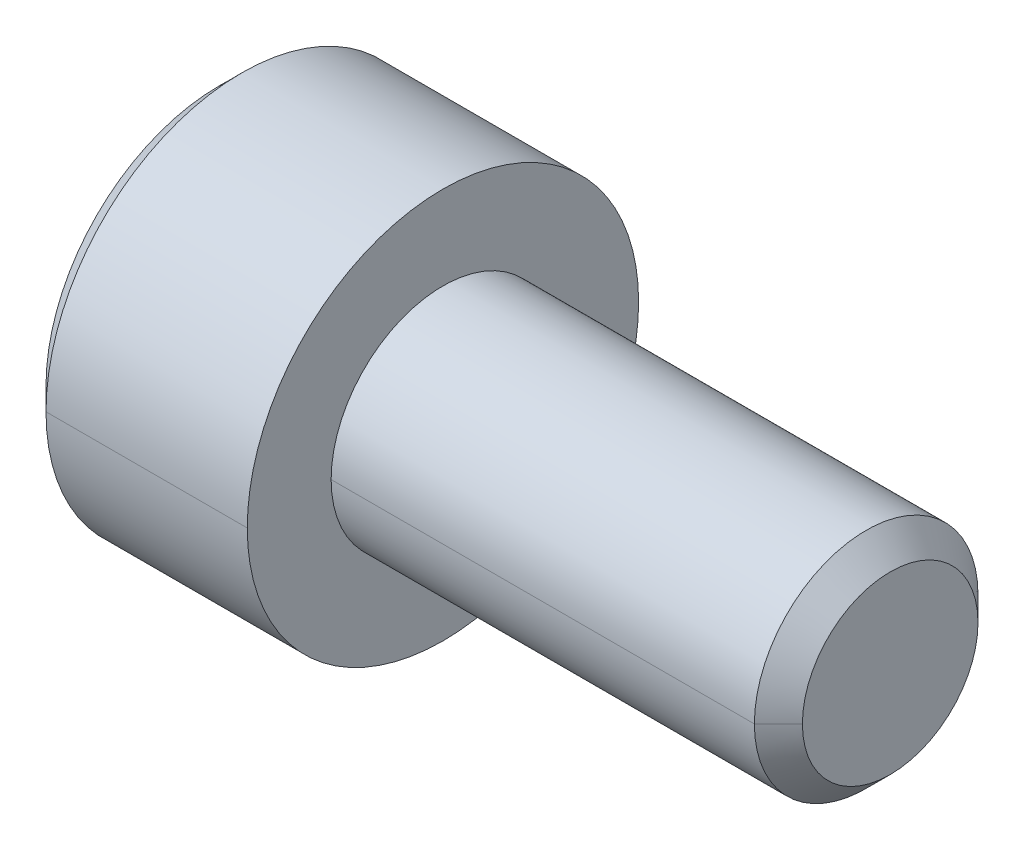
ISO-10303-21;
HEADER;
FILE_DESCRIPTION(('STEP AP214'),'2;1');
FILE_NAME('part.step','',(''),(''),'','','');
FILE_SCHEMA(('AUTOMOTIVE_DESIGN { 1 0 10303 214 1 1 1 1 }'));
ENDSEC;
DATA;
#1=APPLICATION_CONTEXT('core data for automotive mechanical design processes');
#2=APPLICATION_PROTOCOL_DEFINITION('international standard','automotive_design',2000,#1);
#3=PRODUCT_CONTEXT('',#1,'mechanical');
#4=PRODUCT('Part','Part','',(#3));
#5=PRODUCT_RELATED_PRODUCT_CATEGORY('part','',(#4));
#6=PRODUCT_DEFINITION_FORMATION('','',#4);
#7=PRODUCT_DEFINITION_CONTEXT('part definition',#1,'design');
#8=PRODUCT_DEFINITION('design','',#6,#7);
#9=PRODUCT_DEFINITION_SHAPE('','',#8);
#10=(LENGTH_UNIT() NAMED_UNIT(*) SI_UNIT(.MILLI.,.METRE.));
#11=(NAMED_UNIT(*) PLANE_ANGLE_UNIT() SI_UNIT($,.RADIAN.));
#12=(NAMED_UNIT(*) SI_UNIT($,.STERADIAN.) SOLID_ANGLE_UNIT());
#13=UNCERTAINTY_MEASURE_WITH_UNIT(LENGTH_MEASURE(1.E-05),#10,'distance_accuracy_value','');
#14=(GEOMETRIC_REPRESENTATION_CONTEXT(3) GLOBAL_UNCERTAINTY_ASSIGNED_CONTEXT((#13)) GLOBAL_UNIT_ASSIGNED_CONTEXT((#10,
#11,#12)) REPRESENTATION_CONTEXT('',''));
#15=CARTESIAN_POINT('',(0.,0.,0.));
#16=DIRECTION('',(0.,0.,1.));
#17=DIRECTION('',(1.,0.,0.));
#18=AXIS2_PLACEMENT_3D('',#15,#16,#17);
#19=CARTESIAN_POINT('',(-4.,0.,0.));
#20=DIRECTION('',(1.,0.,0.));
#21=DIRECTION('',(0.,-1.,0.));
#22=AXIS2_PLACEMENT_3D('',#19,#20,#21);
#23=CONICAL_SURFACE('',#22,3.1,0.7853981634);
#24=CARTESIAN_POINT('',(-3.6,0.,0.));
#25=DIRECTION('',(1.,0.,0.));
#26=DIRECTION('',(0.,0.,-1.));
#27=AXIS2_PLACEMENT_3D('',#24,#25,#26);
#28=CIRCLE('',#27,3.5);
#29=CARTESIAN_POINT('',(-3.6,0.,-3.5));
#30=VERTEX_POINT('',#29);
#31=CARTESIAN_POINT('',(-3.60000000000102,0.,3.50000000000102));
#32=VERTEX_POINT('',#31);
#33=EDGE_CURVE('E13',#30,#32,#28,.T.);
#34=ORIENTED_EDGE('',*,*,#33,.F.);
#35=DIRECTION('',(0.707106781184743,0.,-0.707106781188352));
#36=VECTOR('',#35,1.);
#37=CARTESIAN_POINT('',(-4.,0.,-3.1));
#38=LINE('',#37,#36);
#39=CARTESIAN_POINT('',(-4.,0.,-3.1));
#40=VERTEX_POINT('',#39);
#41=EDGE_CURVE('E34',#40,#30,#38,.T.);
#42=ORIENTED_EDGE('',*,*,#41,.F.);
#43=CARTESIAN_POINT('',(-4.,0.,0.));
#44=DIRECTION('',(1.,0.,0.));
#45=DIRECTION('',(0.,0.,-1.));
#46=AXIS2_PLACEMENT_3D('',#43,#44,#45);
#47=CIRCLE('',#46,3.1);
#48=CARTESIAN_POINT('',(-4.,0.,3.1));
#49=VERTEX_POINT('',#48);
#50=EDGE_CURVE('E205',#40,#49,#47,.T.);
#51=ORIENTED_EDGE('',*,*,#50,.T.);
#52=DIRECTION('',(0.707106781184743,0.,0.707106781188352));
#53=VECTOR('',#52,1.);
#54=CARTESIAN_POINT('',(-4.,0.,3.1));
#55=LINE('',#54,#53);
#56=EDGE_CURVE('E201',#49,#32,#55,.T.);
#57=ORIENTED_EDGE('',*,*,#56,.T.);
#58=EDGE_LOOP('',(#34,#42,#51,#57));
#59=FACE_BOUND('',#58,.T.);
#60=ADVANCED_FACE('F25',(#59),#23,.T.);
#61=CARTESIAN_POINT('',(-4.,0.,0.));
#62=DIRECTION('',(1.,0.,0.));
#63=DIRECTION('',(0.,1.,0.));
#64=AXIS2_PLACEMENT_3D('',#61,#62,#63);
#65=CONICAL_SURFACE('',#64,3.1,0.7853981634);
#66=CARTESIAN_POINT('',(-4.,0.,0.));
#67=DIRECTION('',(1.,0.,0.));
#68=DIRECTION('',(0.,0.,-1.));
#69=AXIS2_PLACEMENT_3D('',#66,#67,#68);
#70=CIRCLE('',#69,3.1);
#71=EDGE_CURVE('E200',#49,#40,#70,.T.);
#72=ORIENTED_EDGE('',*,*,#71,.T.);
#73=ORIENTED_EDGE('',*,*,#41,.T.);
#74=CARTESIAN_POINT('',(-3.6,0.,0.));
#75=DIRECTION('',(1.,0.,0.));
#76=DIRECTION('',(0.,0.,-1.));
#77=AXIS2_PLACEMENT_3D('',#74,#75,#76);
#78=CIRCLE('',#77,3.5);
#79=EDGE_CURVE('E488',#32,#30,#78,.T.);
#80=ORIENTED_EDGE('',*,*,#79,.F.);
#81=ORIENTED_EDGE('',*,*,#56,.F.);
#82=EDGE_LOOP('',(#72,#73,#80,#81));
#83=FACE_BOUND('',#82,.T.);
#84=ADVANCED_FACE('F504',(#83),#65,.T.);
#85=CARTESIAN_POINT('',(8.,0.,0.));
#86=DIRECTION('',(-1.,0.,0.));
#87=DIRECTION('',(0.,1.,0.));
#88=AXIS2_PLACEMENT_3D('',#85,#86,#87);
#89=CYLINDRICAL_SURFACE('',#88,3.5);
#90=ORIENTED_EDGE('',*,*,#79,.T.);
#91=DIRECTION('',(-1.,0.,0.));
#92=VECTOR('',#91,1.);
#93=CARTESIAN_POINT('',(0.,0.,-3.5));
#94=LINE('',#93,#92);
#95=CARTESIAN_POINT('',(0.,0.,-3.5));
#96=VERTEX_POINT('',#95);
#97=EDGE_CURVE('E482',#96,#30,#94,.T.);
#98=ORIENTED_EDGE('',*,*,#97,.F.);
#99=CARTESIAN_POINT('',(0.,0.,0.));
#100=DIRECTION('',(1.,0.,0.));
#101=DIRECTION('',(0.,0.,-1.));
#102=AXIS2_PLACEMENT_3D('',#99,#100,#101);
#103=CIRCLE('',#102,3.5);
#104=CARTESIAN_POINT('',(0.,0.,3.5));
#105=VERTEX_POINT('',#104);
#106=EDGE_CURVE('E478',#105,#96,#103,.T.);
#107=ORIENTED_EDGE('',*,*,#106,.F.);
#108=DIRECTION('',(-1.,0.,0.));
#109=VECTOR('',#108,1.);
#110=CARTESIAN_POINT('',(0.,0.,3.5));
#111=LINE('',#110,#109);
#112=EDGE_CURVE('E476',#105,#32,#111,.T.);
#113=ORIENTED_EDGE('',*,*,#112,.T.);
#114=EDGE_LOOP('',(#90,#98,#107,#113));
#115=FACE_BOUND('',#114,.T.);
#116=ADVANCED_FACE('F510',(#115),#89,.T.);
#117=CARTESIAN_POINT('',(8.,0.,0.));
#118=DIRECTION('',(-1.,0.,0.));
#119=DIRECTION('',(0.,-1.,0.));
#120=AXIS2_PLACEMENT_3D('',#117,#118,#119);
#121=CYLINDRICAL_SURFACE('',#120,3.5);
#122=CARTESIAN_POINT('',(0.,0.,0.));
#123=DIRECTION('',(1.,0.,0.));
#124=DIRECTION('',(0.,0.,-1.));
#125=AXIS2_PLACEMENT_3D('',#122,#123,#124);
#126=CIRCLE('',#125,3.5);
#127=EDGE_CURVE('E515',#96,#105,#126,.T.);
#128=ORIENTED_EDGE('',*,*,#127,.F.);
#129=ORIENTED_EDGE('',*,*,#97,.T.);
#130=ORIENTED_EDGE('',*,*,#33,.T.);
#131=ORIENTED_EDGE('',*,*,#112,.F.);
#132=EDGE_LOOP('',(#128,#129,#130,#131));
#133=FACE_BOUND('',#132,.T.);
#134=ADVANCED_FACE('F516',(#133),#121,.T.);
#135=CARTESIAN_POINT('',(0.,3.5,0.));
#136=DIRECTION('',(-1.,0.,0.));
#137=DIRECTION('',(0.,0.,1.));
#138=AXIS2_PLACEMENT_3D('',#135,#136,#137);
#139=PLANE('',#138);
#140=CARTESIAN_POINT('',(0.,0.,0.));
#141=DIRECTION('',(1.,0.,0.));
#142=DIRECTION('',(0.,0.,-1.));
#143=AXIS2_PLACEMENT_3D('',#140,#141,#142);
#144=CIRCLE('',#143,2.);
#145=CARTESIAN_POINT('',(0.,0.,-2.));
#146=VERTEX_POINT('',#145);
#147=CARTESIAN_POINT('',(0.,0.,2.));
#148=VERTEX_POINT('',#147);
#149=EDGE_CURVE('E519',#146,#148,#144,.T.);
#150=ORIENTED_EDGE('',*,*,#149,.F.);
#151=CARTESIAN_POINT('',(0.,0.,0.));
#152=DIRECTION('',(1.,0.,0.));
#153=DIRECTION('',(0.,0.,-1.));
#154=AXIS2_PLACEMENT_3D('',#151,#152,#153);
#155=CIRCLE('',#154,2.);
#156=EDGE_CURVE('E463',#148,#146,#155,.T.);
#157=ORIENTED_EDGE('',*,*,#156,.F.);
#158=EDGE_LOOP('',(#150,#157));
#159=FACE_BOUND('',#158,.T.);
#160=ORIENTED_EDGE('',*,*,#127,.T.);
#161=ORIENTED_EDGE('',*,*,#106,.T.);
#162=EDGE_LOOP('',(#160,#161));
#163=FACE_BOUND('',#162,.T.);
#164=ADVANCED_FACE('F521',(#159,#163),#139,.F.);
#165=CARTESIAN_POINT('',(8.,0.,0.));
#166=DIRECTION('',(-1.,0.,0.));
#167=DIRECTION('',(0.,1.,0.));
#168=AXIS2_PLACEMENT_3D('',#165,#166,#167);
#169=CYLINDRICAL_SURFACE('',#168,2.);
#170=ORIENTED_EDGE('',*,*,#156,.T.);
#171=DIRECTION('',(-1.,0.,0.));
#172=VECTOR('',#171,1.);
#173=CARTESIAN_POINT('',(7.5705,0.,-2.));
#174=LINE('',#173,#172);
#175=CARTESIAN_POINT('',(7.5705,0.,-2.));
#176=VERTEX_POINT('',#175);
#177=EDGE_CURVE('E458',#176,#146,#174,.T.);
#178=ORIENTED_EDGE('',*,*,#177,.F.);
#179=CARTESIAN_POINT('',(7.5705,0.,0.));
#180=DIRECTION('',(1.,0.,0.));
#181=DIRECTION('',(0.,0.,-1.));
#182=AXIS2_PLACEMENT_3D('',#179,#180,#181);
#183=CIRCLE('',#182,2.);
#184=CARTESIAN_POINT('',(7.5705,0.,2.));
#185=VERTEX_POINT('',#184);
#186=EDGE_CURVE('E457',#185,#176,#183,.T.);
#187=ORIENTED_EDGE('',*,*,#186,.F.);
#188=DIRECTION('',(-1.,0.,0.));
#189=VECTOR('',#188,1.);
#190=CARTESIAN_POINT('',(7.5705,0.,2.));
#191=LINE('',#190,#189);
#192=EDGE_CURVE('E442',#185,#148,#191,.T.);
#193=ORIENTED_EDGE('',*,*,#192,.T.);
#194=EDGE_LOOP('',(#170,#178,#187,#193));
#195=FACE_BOUND('',#194,.T.);
#196=ADVANCED_FACE('F523',(#195),#169,.T.);
#197=CARTESIAN_POINT('',(8.,0.,0.));
#198=DIRECTION('',(-1.,0.,0.));
#199=DIRECTION('',(0.,-1.,0.));
#200=AXIS2_PLACEMENT_3D('',#197,#198,#199);
#201=CYLINDRICAL_SURFACE('',#200,2.);
#202=CARTESIAN_POINT('',(7.5705,0.,0.));
#203=DIRECTION('',(1.,0.,0.));
#204=DIRECTION('',(0.,0.,-1.));
#205=AXIS2_PLACEMENT_3D('',#202,#203,#204);
#206=CIRCLE('',#205,2.);
#207=EDGE_CURVE('E435',#176,#185,#206,.T.);
#208=ORIENTED_EDGE('',*,*,#207,.F.);
#209=ORIENTED_EDGE('',*,*,#177,.T.);
#210=ORIENTED_EDGE('',*,*,#149,.T.);
#211=ORIENTED_EDGE('',*,*,#192,.F.);
#212=EDGE_LOOP('',(#208,#209,#210,#211));
#213=FACE_BOUND('',#212,.T.);
#214=ADVANCED_FACE('F531',(#213),#201,.T.);
#215=CARTESIAN_POINT('',(7.5705,0.,0.));
#216=DIRECTION('',(-1.,0.,0.));
#217=DIRECTION('',(0.,-1.,0.));
#218=AXIS2_PLACEMENT_3D('',#215,#216,#217);
#219=CONICAL_SURFACE('',#218,2.,0.7853981634);
#220=CARTESIAN_POINT('',(8.,0.,0.));
#221=DIRECTION('',(1.,0.,0.));
#222=DIRECTION('',(0.,0.,-1.));
#223=AXIS2_PLACEMENT_3D('',#220,#221,#222);
#224=CIRCLE('',#223,1.5705);
#225=CARTESIAN_POINT('',(8.,0.,-1.5705));
#226=VERTEX_POINT('',#225);
#227=CARTESIAN_POINT('',(7.9999999999989,0.,1.5704999999989));
#228=VERTEX_POINT('',#227);
#229=EDGE_CURVE('E431',#226,#228,#224,.T.);
#230=ORIENTED_EDGE('',*,*,#229,.F.);
#231=DIRECTION('',(-0.707106781184742,0.,-0.707106781188353));
#232=VECTOR('',#231,1.);
#233=CARTESIAN_POINT('',(7.9999999999989,0.,-1.5704999999989));
#234=LINE('',#233,#232);
#235=EDGE_CURVE('E424',#226,#176,#234,.T.);
#236=ORIENTED_EDGE('',*,*,#235,.T.);
#237=ORIENTED_EDGE('',*,*,#207,.T.);
#238=DIRECTION('',(-0.707106781184742,0.,0.707106781188353));
#239=VECTOR('',#238,1.);
#240=CARTESIAN_POINT('',(7.9999999999989,0.,1.5704999999989));
#241=LINE('',#240,#239);
#242=EDGE_CURVE('E410',#228,#185,#241,.T.);
#243=ORIENTED_EDGE('',*,*,#242,.F.);
#244=EDGE_LOOP('',(#230,#236,#237,#243));
#245=FACE_BOUND('',#244,.T.);
#246=ADVANCED_FACE('F568',(#245),#219,.T.);
#247=CARTESIAN_POINT('',(7.5705,0.,0.));
#248=DIRECTION('',(-1.,0.,0.));
#249=DIRECTION('',(0.,1.,0.));
#250=AXIS2_PLACEMENT_3D('',#247,#248,#249);
#251=CONICAL_SURFACE('',#250,2.,0.7853981634);
#252=ORIENTED_EDGE('',*,*,#186,.T.);
#253=ORIENTED_EDGE('',*,*,#235,.F.);
#254=CARTESIAN_POINT('',(8.,0.,0.));
#255=DIRECTION('',(1.,0.,0.));
#256=DIRECTION('',(0.,0.,-1.));
#257=AXIS2_PLACEMENT_3D('',#254,#255,#256);
#258=CIRCLE('',#257,1.5705);
#259=EDGE_CURVE('E404',#228,#226,#258,.T.);
#260=ORIENTED_EDGE('',*,*,#259,.F.);
#261=ORIENTED_EDGE('',*,*,#242,.T.);
#262=EDGE_LOOP('',(#252,#253,#260,#261));
#263=FACE_BOUND('',#262,.T.);
#264=ADVANCED_FACE('F577',(#263),#251,.T.);
#265=CARTESIAN_POINT('',(8.,1.5705,0.));
#266=DIRECTION('',(-1.,0.,0.));
#267=DIRECTION('',(0.,0.,1.));
#268=AXIS2_PLACEMENT_3D('',#265,#266,#267);
#269=PLANE('',#268);
#270=ORIENTED_EDGE('',*,*,#229,.T.);
#271=ORIENTED_EDGE('',*,*,#259,.T.);
#272=EDGE_LOOP('',(#270,#271));
#273=FACE_BOUND('',#272,.T.);
#274=ADVANCED_FACE('F586',(#273),#269,.F.);
#275=CARTESIAN_POINT('',(-4.,0.,0.));
#276=DIRECTION('',(1.,0.,0.));
#277=DIRECTION('',(0.,0.,-1.));
#278=AXIS2_PLACEMENT_3D('',#275,#276,#277);
#279=PLANE('',#278);
#280=ORIENTED_EDGE('',*,*,#50,.F.);
#281=ORIENTED_EDGE('',*,*,#71,.F.);
#282=EDGE_LOOP('',(#280,#281));
#283=FACE_BOUND('',#282,.T.);
#284=DIRECTION('',(0.,0.500000000000009,-0.866025403784433));
#285=VECTOR('',#284,1.);
#286=CARTESIAN_POINT('',(-4.,-1.7320508075689,0.));
#287=LINE('',#286,#285);
#288=CARTESIAN_POINT('',(-4.,-1.7320508075689,0.));
#289=VERTEX_POINT('',#288);
#290=CARTESIAN_POINT('',(-4.,-0.86602540378444,-1.5));
#291=VERTEX_POINT('',#290);
#292=EDGE_CURVE('E393',#289,#291,#287,.T.);
#293=ORIENTED_EDGE('',*,*,#292,.T.);
#294=DIRECTION('',(0.,1.,0.));
#295=VECTOR('',#294,1.);
#296=CARTESIAN_POINT('',(-4.,-0.86602540378444,-1.5));
#297=LINE('',#296,#295);
#298=CARTESIAN_POINT('',(-4.,0.86602540378444,-1.5));
#299=VERTEX_POINT('',#298);
#300=EDGE_CURVE('E405',#291,#299,#297,.T.);
#301=ORIENTED_EDGE('',*,*,#300,.T.);
#302=DIRECTION('',(0.,0.500000000000009,0.866025403784433));
#303=VECTOR('',#302,1.);
#304=CARTESIAN_POINT('',(-4.,0.86602540378444,-1.5));
#305=LINE('',#304,#303);
#306=CARTESIAN_POINT('',(-4.,1.7320508075689,0.));
#307=VERTEX_POINT('',#306);
#308=EDGE_CURVE('E412',#299,#307,#305,.T.);
#309=ORIENTED_EDGE('',*,*,#308,.T.);
#310=DIRECTION('',(0.,-0.500000000000009,0.866025403784433));
#311=VECTOR('',#310,1.);
#312=CARTESIAN_POINT('',(-4.,1.7320508075689,0.));
#313=LINE('',#312,#311);
#314=CARTESIAN_POINT('',(-4.,0.86602540378444,1.5));
#315=VERTEX_POINT('',#314);
#316=EDGE_CURVE('E277',#307,#315,#313,.T.);
#317=ORIENTED_EDGE('',*,*,#316,.T.);
#318=DIRECTION('',(0.,-1.,0.));
#319=VECTOR('',#318,1.);
#320=CARTESIAN_POINT('',(-4.,0.86602540378444,1.5));
#321=LINE('',#320,#319);
#322=CARTESIAN_POINT('',(-4.,-0.86602540378444,1.5));
#323=VERTEX_POINT('',#322);
#324=EDGE_CURVE('E273',#315,#323,#321,.T.);
#325=ORIENTED_EDGE('',*,*,#324,.T.);
#326=DIRECTION('',(0.,-0.500000000000009,-0.866025403784433));
#327=VECTOR('',#326,1.);
#328=CARTESIAN_POINT('',(-4.,-0.86602540378444,1.5));
#329=LINE('',#328,#327);
#330=EDGE_CURVE('E271',#323,#289,#329,.T.);
#331=ORIENTED_EDGE('',*,*,#330,.T.);
#332=EDGE_LOOP('',(#293,#301,#309,#317,#325,#331));
#333=FACE_BOUND('',#332,.T.);
#334=ADVANCED_FACE('F391',(#283,#333),#279,.F.);
#335=CARTESIAN_POINT('',(-2.,-0.86602540378444,1.5));
#336=DIRECTION('',(0.,0.866025403784433,-0.500000000000009));
#337=DIRECTION('',(0.,0.500000000000009,0.866025403784433));
#338=AXIS2_PLACEMENT_3D('',#335,#336,#337);
#339=PLANE('',#338);
#340=ORIENTED_EDGE('',*,*,#330,.F.);
#341=DIRECTION('',(-1.,0.,0.));
#342=VECTOR('',#341,1.);
#343=CARTESIAN_POINT('',(-2.,-0.86602540378444,1.5));
#344=LINE('',#343,#342);
#345=CARTESIAN_POINT('',(-2.,-0.86602540378444,1.5));
#346=VERTEX_POINT('',#345);
#347=EDGE_CURVE('E380',#346,#323,#344,.T.);
#348=ORIENTED_EDGE('',*,*,#347,.F.);
#349=DIRECTION('',(0.,-0.500000000000009,-0.866025403784433));
#350=VECTOR('',#349,1.);
#351=CARTESIAN_POINT('',(-2.,-0.86602540378444,1.5));
#352=LINE('',#351,#350);
#353=CARTESIAN_POINT('',(-2.,-1.29903810567666,0.750000000000019));
#354=VERTEX_POINT('',#353);
#355=EDGE_CURVE('E375',#346,#354,#352,.T.);
#356=ORIENTED_EDGE('',*,*,#355,.T.);
#357=DIRECTION('',(0.,-0.500000000000009,-0.866025403784433));
#358=VECTOR('',#357,1.);
#359=CARTESIAN_POINT('',(-2.,-0.86602540378444,1.5));
#360=LINE('',#359,#358);
#361=CARTESIAN_POINT('',(-2.,-1.7320508075689,0.));
#362=VERTEX_POINT('',#361);
#363=EDGE_CURVE('E370',#354,#362,#360,.T.);
#364=ORIENTED_EDGE('',*,*,#363,.T.);
#365=DIRECTION('',(-1.,0.,0.));
#366=VECTOR('',#365,1.);
#367=CARTESIAN_POINT('',(-2.,-1.7320508075689,0.));
#368=LINE('',#367,#366);
#369=EDGE_CURVE('E364',#362,#289,#368,.T.);
#370=ORIENTED_EDGE('',*,*,#369,.T.);
#371=EDGE_LOOP('',(#340,#348,#356,#364,#370));
#372=FACE_BOUND('',#371,.T.);
#373=ADVANCED_FACE('F396',(#372),#339,.T.);
#374=CARTESIAN_POINT('',(-2.,-1.7320508075689,0.));
#375=DIRECTION('',(0.,0.866025403784433,0.500000000000009));
#376=DIRECTION('',(0.,-0.500000000000009,0.866025403784433));
#377=AXIS2_PLACEMENT_3D('',#374,#375,#376);
#378=PLANE('',#377);
#379=ORIENTED_EDGE('',*,*,#292,.F.);
#380=ORIENTED_EDGE('',*,*,#369,.F.);
#381=DIRECTION('',(0.,0.500000000000009,-0.866025403784433));
#382=VECTOR('',#381,1.);
#383=CARTESIAN_POINT('',(-2.,-1.7320508075689,0.));
#384=LINE('',#383,#382);
#385=CARTESIAN_POINT('',(-2.,-1.29903810567665,-0.750000000000014));
#386=VERTEX_POINT('',#385);
#387=EDGE_CURVE('E359',#362,#386,#384,.T.);
#388=ORIENTED_EDGE('',*,*,#387,.T.);
#389=DIRECTION('',(0.,0.500000000000009,-0.866025403784433));
#390=VECTOR('',#389,1.);
#391=CARTESIAN_POINT('',(-2.,-1.7320508075689,0.));
#392=LINE('',#391,#390);
#393=CARTESIAN_POINT('',(-2.,-0.86602540378444,-1.5));
#394=VERTEX_POINT('',#393);
#395=EDGE_CURVE('E354',#386,#394,#392,.T.);
#396=ORIENTED_EDGE('',*,*,#395,.T.);
#397=DIRECTION('',(-1.,0.,0.));
#398=VECTOR('',#397,1.);
#399=CARTESIAN_POINT('',(-2.,-0.86602540378444,-1.5));
#400=LINE('',#399,#398);
#401=EDGE_CURVE('E348',#394,#291,#400,.T.);
#402=ORIENTED_EDGE('',*,*,#401,.T.);
#403=EDGE_LOOP('',(#379,#380,#388,#396,#402));
#404=FACE_BOUND('',#403,.T.);
#405=ADVANCED_FACE('F400',(#404),#378,.T.);
#406=CARTESIAN_POINT('',(-2.,-0.86602540378444,-1.5));
#407=DIRECTION('',(0.,0.,1.));
#408=DIRECTION('',(1.,0.,0.));
#409=AXIS2_PLACEMENT_3D('',#406,#407,#408);
#410=PLANE('',#409);
#411=ORIENTED_EDGE('',*,*,#300,.F.);
#412=ORIENTED_EDGE('',*,*,#401,.F.);
#413=DIRECTION('',(0.,1.,0.));
#414=VECTOR('',#413,1.);
#415=CARTESIAN_POINT('',(-2.,-0.86602540378444,-1.5));
#416=LINE('',#415,#414);
#417=CARTESIAN_POINT('',(-2.,0.,-1.5));
#418=VERTEX_POINT('',#417);
#419=EDGE_CURVE('E343',#394,#418,#416,.T.);
#420=ORIENTED_EDGE('',*,*,#419,.T.);
#421=DIRECTION('',(0.,1.,0.));
#422=VECTOR('',#421,1.);
#423=CARTESIAN_POINT('',(-2.,-0.86602540378444,-1.5));
#424=LINE('',#423,#422);
#425=CARTESIAN_POINT('',(-2.,0.86602540378444,-1.5));
#426=VERTEX_POINT('',#425);
#427=EDGE_CURVE('E338',#418,#426,#424,.T.);
#428=ORIENTED_EDGE('',*,*,#427,.T.);
#429=DIRECTION('',(-1.,0.,0.));
#430=VECTOR('',#429,1.);
#431=CARTESIAN_POINT('',(-2.,0.86602540378444,-1.5));
#432=LINE('',#431,#430);
#433=EDGE_CURVE('E332',#426,#299,#432,.T.);
#434=ORIENTED_EDGE('',*,*,#433,.T.);
#435=EDGE_LOOP('',(#411,#412,#420,#428,#434));
#436=FACE_BOUND('',#435,.T.);
#437=ADVANCED_FACE('F617',(#436),#410,.T.);
#438=CARTESIAN_POINT('',(-2.,0.86602540378444,-1.5));
#439=DIRECTION('',(0.,-0.866025403784433,0.500000000000009));
#440=DIRECTION('',(0.,-0.500000000000009,-0.866025403784433));
#441=AXIS2_PLACEMENT_3D('',#438,#439,#440);
#442=PLANE('',#441);
#443=ORIENTED_EDGE('',*,*,#308,.F.);
#444=ORIENTED_EDGE('',*,*,#433,.F.);
#445=DIRECTION('',(0.,0.500000000000009,0.866025403784433));
#446=VECTOR('',#445,1.);
#447=CARTESIAN_POINT('',(-2.,0.86602540378444,-1.5));
#448=LINE('',#447,#446);
#449=CARTESIAN_POINT('',(-2.,1.29903810567666,-0.750000000000019));
#450=VERTEX_POINT('',#449);
#451=EDGE_CURVE('E326',#426,#450,#448,.T.);
#452=ORIENTED_EDGE('',*,*,#451,.T.);
#453=DIRECTION('',(0.,0.500000000000009,0.866025403784433));
#454=VECTOR('',#453,1.);
#455=CARTESIAN_POINT('',(-2.,0.86602540378444,-1.5));
#456=LINE('',#455,#454);
#457=CARTESIAN_POINT('',(-2.,1.7320508075689,0.));
#458=VERTEX_POINT('',#457);
#459=EDGE_CURVE('E321',#450,#458,#456,.T.);
#460=ORIENTED_EDGE('',*,*,#459,.T.);
#461=DIRECTION('',(-1.,0.,0.));
#462=VECTOR('',#461,1.);
#463=CARTESIAN_POINT('',(-2.,1.7320508075689,0.));
#464=LINE('',#463,#462);
#465=EDGE_CURVE('E315',#458,#307,#464,.T.);
#466=ORIENTED_EDGE('',*,*,#465,.T.);
#467=EDGE_LOOP('',(#443,#444,#452,#460,#466));
#468=FACE_BOUND('',#467,.T.);
#469=ADVANCED_FACE('F625',(#468),#442,.T.);
#470=CARTESIAN_POINT('',(-2.,1.7320508075689,0.));
#471=DIRECTION('',(0.,-0.866025403784433,-0.500000000000009));
#472=DIRECTION('',(0.,0.500000000000009,-0.866025403784433));
#473=AXIS2_PLACEMENT_3D('',#470,#471,#472);
#474=PLANE('',#473);
#475=ORIENTED_EDGE('',*,*,#316,.F.);
#476=ORIENTED_EDGE('',*,*,#465,.F.);
#477=DIRECTION('',(0.,-0.500000000000009,0.866025403784433));
#478=VECTOR('',#477,1.);
#479=CARTESIAN_POINT('',(-2.,1.7320508075689,0.));
#480=LINE('',#479,#478);
#481=CARTESIAN_POINT('',(-2.,1.29903810567666,0.750000000000019));
#482=VERTEX_POINT('',#481);
#483=EDGE_CURVE('E310',#458,#482,#480,.T.);
#484=ORIENTED_EDGE('',*,*,#483,.T.);
#485=DIRECTION('',(0.,-0.500000000000009,0.866025403784433));
#486=VECTOR('',#485,1.);
#487=CARTESIAN_POINT('',(-2.,1.7320508075689,0.));
#488=LINE('',#487,#486);
#489=CARTESIAN_POINT('',(-2.,0.86602540378444,1.5));
#490=VERTEX_POINT('',#489);
#491=EDGE_CURVE('E305',#482,#490,#488,.T.);
#492=ORIENTED_EDGE('',*,*,#491,.T.);
#493=DIRECTION('',(-1.,0.,0.));
#494=VECTOR('',#493,1.);
#495=CARTESIAN_POINT('',(-2.,0.86602540378444,1.5));
#496=LINE('',#495,#494);
#497=EDGE_CURVE('E299',#490,#315,#496,.T.);
#498=ORIENTED_EDGE('',*,*,#497,.T.);
#499=EDGE_LOOP('',(#475,#476,#484,#492,#498));
#500=FACE_BOUND('',#499,.T.);
#501=ADVANCED_FACE('F634',(#500),#474,.T.);
#502=CARTESIAN_POINT('',(-2.,0.86602540378444,1.5));
#503=DIRECTION('',(0.,0.,-1.));
#504=DIRECTION('',(-1.,0.,0.));
#505=AXIS2_PLACEMENT_3D('',#502,#503,#504);
#506=PLANE('',#505);
#507=ORIENTED_EDGE('',*,*,#324,.F.);
#508=ORIENTED_EDGE('',*,*,#497,.F.);
#509=DIRECTION('',(0.,-1.,0.));
#510=VECTOR('',#509,1.);
#511=CARTESIAN_POINT('',(-2.,0.86602540378444,1.5));
#512=LINE('',#511,#510);
#513=CARTESIAN_POINT('',(-2.,0.,1.5));
#514=VERTEX_POINT('',#513);
#515=EDGE_CURVE('E294',#490,#514,#512,.T.);
#516=ORIENTED_EDGE('',*,*,#515,.T.);
#517=DIRECTION('',(0.,-1.,0.));
#518=VECTOR('',#517,1.);
#519=CARTESIAN_POINT('',(-2.,0.86602540378444,1.5));
#520=LINE('',#519,#518);
#521=EDGE_CURVE('E159',#514,#346,#520,.T.);
#522=ORIENTED_EDGE('',*,*,#521,.T.);
#523=ORIENTED_EDGE('',*,*,#347,.T.);
#524=EDGE_LOOP('',(#507,#508,#516,#522,#523));
#525=FACE_BOUND('',#524,.T.);
#526=ADVANCED_FACE('F643',(#525),#506,.T.);
#527=CARTESIAN_POINT('',(-2.,0.,0.));
#528=DIRECTION('',(1.,0.,0.));
#529=DIRECTION('',(0.,0.,-1.));
#530=AXIS2_PLACEMENT_3D('',#527,#528,#529);
#531=PLANE('',#530);
#532=CARTESIAN_POINT('',(-2.,0.,0.));
#533=DIRECTION('',(1.,0.,0.));
#534=DIRECTION('',(0.,0.,-1.));
#535=AXIS2_PLACEMENT_3D('',#532,#533,#534);
#536=CIRCLE('',#535,1.5);
#537=EDGE_CURVE('E140',#514,#354,#536,.T.);
#538=ORIENTED_EDGE('',*,*,#537,.T.);
#539=ORIENTED_EDGE('',*,*,#355,.F.);
#540=ORIENTED_EDGE('',*,*,#521,.F.);
#541=EDGE_LOOP('',(#538,#539,#540));
#542=FACE_BOUND('',#541,.T.);
#543=ADVANCED_FACE('F652',(#542),#531,.F.);
#544=CARTESIAN_POINT('',(-2.,0.,0.));
#545=DIRECTION('',(-1.,0.,0.));
#546=DIRECTION('',(0.,1.,0.));
#547=AXIS2_PLACEMENT_3D('',#544,#545,#546);
#548=CONICAL_SURFACE('',#547,1.5,1.308996939);
#549=DIRECTION('',(-0.258819045098413,0.,-0.965925826290169));
#550=VECTOR('',#549,1.);
#551=CARTESIAN_POINT('',(-1.59807621136015,0.,0.));
#552=LINE('',#551,#550);
#553=CARTESIAN_POINT('',(-1.5980762113533,0.,0.));
#554=VERTEX_POINT('',#553);
#555=EDGE_CURVE('E136',#554,#418,#552,.T.);
#556=ORIENTED_EDGE('',*,*,#555,.T.);
#557=CARTESIAN_POINT('',(-2.,0.,0.));
#558=DIRECTION('',(1.,0.,0.));
#559=DIRECTION('',(0.,0.,-1.));
#560=AXIS2_PLACEMENT_3D('',#557,#558,#559);
#561=CIRCLE('',#560,1.5);
#562=EDGE_CURVE('E154',#386,#418,#561,.T.);
#563=ORIENTED_EDGE('',*,*,#562,.F.);
#564=CARTESIAN_POINT('',(-2.,0.,0.));
#565=DIRECTION('',(1.,0.,0.));
#566=DIRECTION('',(0.,0.,-1.));
#567=AXIS2_PLACEMENT_3D('',#564,#565,#566);
#568=CIRCLE('',#567,1.5);
#569=EDGE_CURVE('E145',#354,#386,#568,.T.);
#570=ORIENTED_EDGE('',*,*,#569,.F.);
#571=ORIENTED_EDGE('',*,*,#537,.F.);
#572=DIRECTION('',(-0.258819045098413,0.,0.965925826290169));
#573=VECTOR('',#572,1.);
#574=CARTESIAN_POINT('',(-1.59807621136015,0.,0.));
#575=LINE('',#574,#573);
#576=EDGE_CURVE('E132',#554,#514,#575,.T.);
#577=ORIENTED_EDGE('',*,*,#576,.F.);
#578=EDGE_LOOP('',(#556,#563,#570,#571,#577));
#579=FACE_BOUND('',#578,.T.);
#580=ADVANCED_FACE('F134',(#579),#548,.F.);
#581=CARTESIAN_POINT('',(-2.,0.,0.));
#582=DIRECTION('',(-1.,0.,0.));
#583=DIRECTION('',(0.,-1.,0.));
#584=AXIS2_PLACEMENT_3D('',#581,#582,#583);
#585=CONICAL_SURFACE('',#584,1.5,1.308996939);
#586=ORIENTED_EDGE('',*,*,#576,.T.);
#587=CARTESIAN_POINT('',(-2.,0.,0.));
#588=DIRECTION('',(1.,0.,0.));
#589=DIRECTION('',(0.,0.,-1.));
#590=AXIS2_PLACEMENT_3D('',#587,#588,#589);
#591=CIRCLE('',#590,1.5);
#592=EDGE_CURVE('E146',#482,#514,#591,.T.);
#593=ORIENTED_EDGE('',*,*,#592,.F.);
#594=CARTESIAN_POINT('',(-2.,0.,0.));
#595=DIRECTION('',(1.,0.,0.));
#596=DIRECTION('',(0.,0.,-1.));
#597=AXIS2_PLACEMENT_3D('',#594,#595,#596);
#598=CIRCLE('',#597,1.5);
#599=EDGE_CURVE('E855',#450,#482,#598,.T.);
#600=ORIENTED_EDGE('',*,*,#599,.F.);
#601=CARTESIAN_POINT('',(-2.,0.,0.));
#602=DIRECTION('',(1.,0.,0.));
#603=DIRECTION('',(0.,0.,-1.));
#604=AXIS2_PLACEMENT_3D('',#601,#602,#603);
#605=CIRCLE('',#604,1.5);
#606=EDGE_CURVE('E151',#418,#450,#605,.T.);
#607=ORIENTED_EDGE('',*,*,#606,.F.);
#608=ORIENTED_EDGE('',*,*,#555,.F.);
#609=EDGE_LOOP('',(#586,#593,#600,#607,#608));
#610=FACE_BOUND('',#609,.T.);
#611=ADVANCED_FACE('F148',(#610),#585,.F.);
#612=CARTESIAN_POINT('',(-2.,0.,0.));
#613=DIRECTION('',(1.,0.,0.));
#614=DIRECTION('',(0.,0.,-1.));
#615=AXIS2_PLACEMENT_3D('',#612,#613,#614);
#616=PLANE('',#615);
#617=ORIENTED_EDGE('',*,*,#606,.T.);
#618=ORIENTED_EDGE('',*,*,#451,.F.);
#619=ORIENTED_EDGE('',*,*,#427,.F.);
#620=EDGE_LOOP('',(#617,#618,#619));
#621=FACE_BOUND('',#620,.T.);
#622=ADVANCED_FACE('F675',(#621),#616,.F.);
#623=CARTESIAN_POINT('',(-2.,0.,0.));
#624=DIRECTION('',(1.,0.,0.));
#625=DIRECTION('',(0.,0.,-1.));
#626=AXIS2_PLACEMENT_3D('',#623,#624,#625);
#627=PLANE('',#626);
#628=ORIENTED_EDGE('',*,*,#459,.F.);
#629=ORIENTED_EDGE('',*,*,#599,.T.);
#630=ORIENTED_EDGE('',*,*,#483,.F.);
#631=EDGE_LOOP('',(#628,#629,#630));
#632=FACE_BOUND('',#631,.T.);
#633=ADVANCED_FACE('F683',(#632),#627,.F.);
#634=CARTESIAN_POINT('',(-2.,0.,0.));
#635=DIRECTION('',(1.,0.,0.));
#636=DIRECTION('',(0.,0.,-1.));
#637=AXIS2_PLACEMENT_3D('',#634,#635,#636);
#638=PLANE('',#637);
#639=ORIENTED_EDGE('',*,*,#592,.T.);
#640=ORIENTED_EDGE('',*,*,#515,.F.);
#641=ORIENTED_EDGE('',*,*,#491,.F.);
#642=EDGE_LOOP('',(#639,#640,#641));
#643=FACE_BOUND('',#642,.T.);
#644=ADVANCED_FACE('F692',(#643),#638,.F.);
#645=CARTESIAN_POINT('',(-2.,0.,0.));
#646=DIRECTION('',(1.,0.,0.));
#647=DIRECTION('',(0.,0.,-1.));
#648=AXIS2_PLACEMENT_3D('',#645,#646,#647);
#649=PLANE('',#648);
#650=ORIENTED_EDGE('',*,*,#569,.T.);
#651=ORIENTED_EDGE('',*,*,#387,.F.);
#652=ORIENTED_EDGE('',*,*,#363,.F.);
#653=EDGE_LOOP('',(#650,#651,#652));
#654=FACE_BOUND('',#653,.T.);
#655=ADVANCED_FACE('F701',(#654),#649,.F.);
#656=CARTESIAN_POINT('',(-2.,0.,0.));
#657=DIRECTION('',(1.,0.,0.));
#658=DIRECTION('',(0.,0.,-1.));
#659=AXIS2_PLACEMENT_3D('',#656,#657,#658);
#660=PLANE('',#659);
#661=ORIENTED_EDGE('',*,*,#562,.T.);
#662=ORIENTED_EDGE('',*,*,#419,.F.);
#663=ORIENTED_EDGE('',*,*,#395,.F.);
#664=EDGE_LOOP('',(#661,#662,#663));
#665=FACE_BOUND('',#664,.T.);
#666=ADVANCED_FACE('F710',(#665),#660,.F.);
#667=CLOSED_SHELL('',(#60,#84,#116,#134,#164,#196,#214,#246,#264,#274,#334,#373,#405,#437,#469,
#501,#526,#543,#580,#611,#622,#633,#644,#655,#666));
#668=MANIFOLD_SOLID_BREP('B1',#667);
#669=ADVANCED_BREP_SHAPE_REPRESENTATION('',(#18,#668),#14);
#670=SHAPE_DEFINITION_REPRESENTATION(#9,#669);
ENDSEC;
END-ISO-10303-21;
